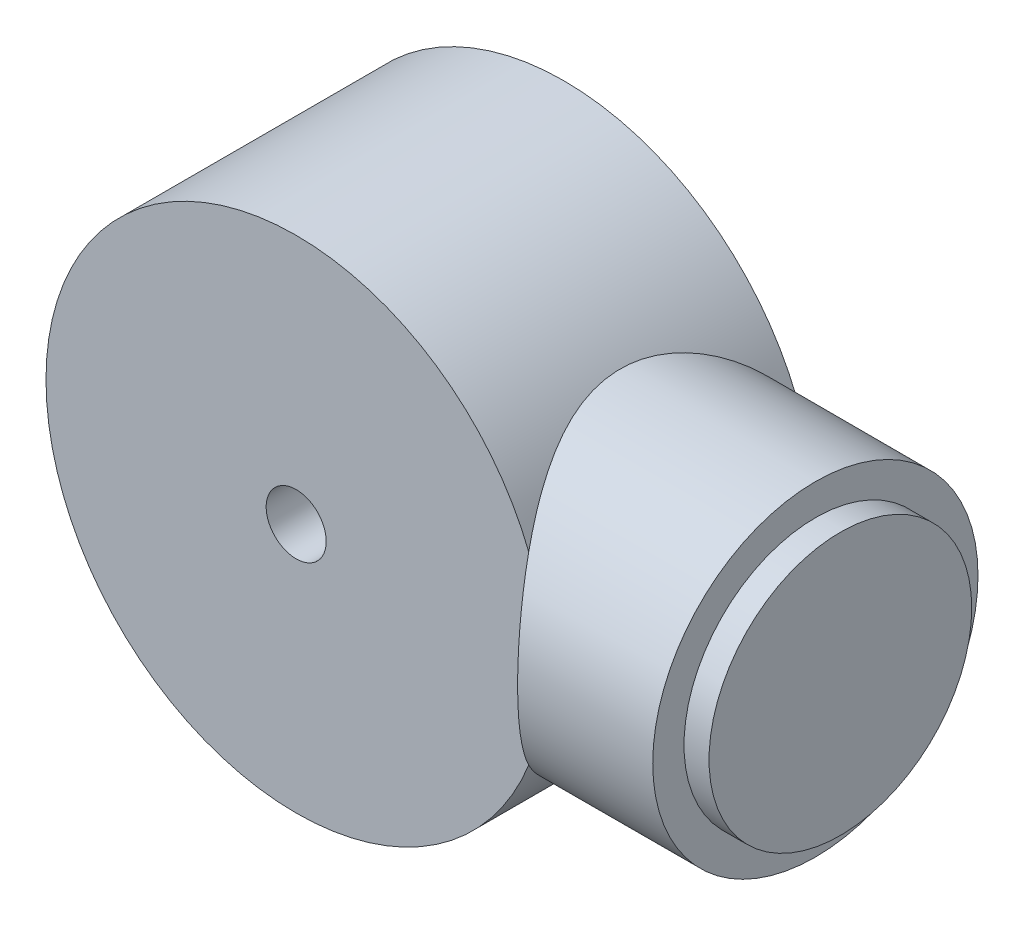
ISO-10303-21;
HEADER;
FILE_DESCRIPTION(('STEP AP214'),'2;1');
FILE_NAME('part.step','',(''),(''),'','','');
FILE_SCHEMA(('AUTOMOTIVE_DESIGN { 1 0 10303 214 1 1 1 1 }'));
ENDSEC;
DATA;
#1=APPLICATION_CONTEXT('core data for automotive mechanical design processes');
#2=APPLICATION_PROTOCOL_DEFINITION('international standard','automotive_design',2000,#1);
#3=PRODUCT_CONTEXT('',#1,'mechanical');
#4=PRODUCT('Part','Part','',(#3));
#5=PRODUCT_RELATED_PRODUCT_CATEGORY('part','',(#4));
#6=PRODUCT_DEFINITION_FORMATION('','',#4);
#7=PRODUCT_DEFINITION_CONTEXT('part definition',#1,'design');
#8=PRODUCT_DEFINITION('design','',#6,#7);
#9=PRODUCT_DEFINITION_SHAPE('','',#8);
#10=(LENGTH_UNIT() NAMED_UNIT(*) SI_UNIT(.MILLI.,.METRE.));
#11=(NAMED_UNIT(*) PLANE_ANGLE_UNIT() SI_UNIT($,.RADIAN.));
#12=(NAMED_UNIT(*) SI_UNIT($,.STERADIAN.) SOLID_ANGLE_UNIT());
#13=UNCERTAINTY_MEASURE_WITH_UNIT(LENGTH_MEASURE(1.E-05),#10,'distance_accuracy_value','');
#14=(GEOMETRIC_REPRESENTATION_CONTEXT(3) GLOBAL_UNCERTAINTY_ASSIGNED_CONTEXT((#13)) GLOBAL_UNIT_ASSIGNED_CONTEXT((#10,
#11,#12)) REPRESENTATION_CONTEXT('',''));
#15=CARTESIAN_POINT('',(0.,0.,0.));
#16=DIRECTION('',(0.,0.,1.));
#17=DIRECTION('',(1.,0.,0.));
#18=AXIS2_PLACEMENT_3D('',#15,#16,#17);
#19=CARTESIAN_POINT('',(0.,0.,26.75));
#20=DIRECTION('',(0.,0.,-1.));
#21=DIRECTION('',(-1.,0.,0.));
#22=AXIS2_PLACEMENT_3D('',#19,#20,#21);
#23=CYLINDRICAL_SURFACE('',#22,50.);
#24=CARTESIAN_POINT('',(0.,0.,26.75));
#25=DIRECTION('',(0.,0.,1.));
#26=DIRECTION('',(1.,0.,0.));
#27=AXIS2_PLACEMENT_3D('',#24,#25,#26);
#28=CIRCLE('',#27,50.);
#29=CARTESIAN_POINT('',(46.4684032434944,18.4577219612822,26.75));
#30=VERTEX_POINT('',#29);
#31=CARTESIAN_POINT('',(46.4684032434944,-18.4577219612822,26.75));
#32=VERTEX_POINT('',#31);
#33=EDGE_CURVE('E52',#30,#32,#28,.T.);
#34=ORIENTED_EDGE('',*,*,#33,.F.);
#35=CARTESIAN_POINT('',(50.,0.,-32.5));
#36=CARTESIAN_POINT('',(49.9999950832951,0.820379898340808,-32.4999946604604));
#37=CARTESIAN_POINT('',(49.9797625626082,1.64084726886599,-32.4688918351983));
#38=CARTESIAN_POINT('',(49.8993279047576,3.27517627569681,-32.3449393474641));
#39=CARTESIAN_POINT('',(49.8391202522668,4.08903698480234,-32.2520811646671));
#40=CARTESIAN_POINT('',(49.6801748227282,5.70432342494345,-32.0059151643629));
#41=CARTESIAN_POINT('',(49.5814093942654,6.50573980179267,-31.8525639639236));
#42=CARTESIAN_POINT('',(49.3477186738602,8.08972592140923,-31.4875684982051));
#43=CARTESIAN_POINT('',(49.212794126871,8.87229605208657,-31.2759254338575));
#44=CARTESIAN_POINT('',(48.9105837019917,10.409890979968,-30.7982018457089));
#45=CARTESIAN_POINT('',(48.7434562311797,11.1650299429453,-30.5323874376159));
#46=CARTESIAN_POINT('',(48.3799715633452,12.6475670057983,-29.9486858544307));
#47=CARTESIAN_POINT('',(48.1836142984633,13.3749650412661,-29.6307985584467));
#48=CARTESIAN_POINT('',(47.7655753618638,14.7986574365594,-28.9460483734245));
#49=CARTESIAN_POINT('',(47.5438947789436,15.4949531318671,-28.5791875899285));
#50=CARTESIAN_POINT('',(47.0793256843562,16.853866771853,-27.7994772651928));
#51=CARTESIAN_POINT('',(46.8364361825179,17.5164831418727,-27.3866255765484));
#52=CARTESIAN_POINT('',(46.31288226742,18.8594396012604,-26.4816990798437));
#53=CARTESIAN_POINT('',(46.030755539401,19.5366956160193,-25.9858940080823));
#54=CARTESIAN_POINT('',(45.4522443941303,20.8472210237898,-24.9467995869055));
#55=CARTESIAN_POINT('',(45.1558593389838,21.4804884457185,-24.4035081121341));
#56=CARTESIAN_POINT('',(44.5542181709047,22.7021098692218,-23.2714119961401));
#57=CARTESIAN_POINT('',(44.2489510586984,23.2904045982318,-22.6825492813084));
#58=CARTESIAN_POINT('',(43.635955205152,24.4195865043336,-21.4621757603436));
#59=CARTESIAN_POINT('',(43.3282263201168,24.9604708916954,-20.8306624484202));
#60=CARTESIAN_POINT('',(42.6711530158535,26.0700560672088,-19.429748088236));
#61=CARTESIAN_POINT('',(42.3224327873107,26.6309119255251,-18.6538149868267));
#62=CARTESIAN_POINT('',(41.6406131212886,27.6848953678642,-17.0504295522222));
#63=CARTESIAN_POINT('',(41.3075169872342,28.1780086711108,-16.2229664092711));
#64=CARTESIAN_POINT('',(40.669017868988,29.0919462219696,-14.5203624327399));
#65=CARTESIAN_POINT('',(40.3635774153682,29.5128689906529,-13.6452887597826));
#66=CARTESIAN_POINT('',(39.7925815815168,30.2783525612671,-11.8500015135482));
#67=CARTESIAN_POINT('',(39.5270080979028,30.6229480570224,-10.9298086820172));
#68=CARTESIAN_POINT('',(39.1151707569848,31.1461312138078,-9.31014237881177));
#69=CARTESIAN_POINT('',(38.9562369559204,31.3442611136038,-8.62015210273462));
#70=CARTESIAN_POINT('',(38.6709512544293,31.695564794545,-7.22220724043617));
#71=CARTESIAN_POINT('',(38.5445940631359,31.848745876524,-6.51425559191747));
#72=CARTESIAN_POINT('',(38.328980642896,32.1079075043085,-5.08516204207146));
#73=CARTESIAN_POINT('',(38.2396737765112,32.213952486247,-4.36403955919714));
#74=CARTESIAN_POINT('',(38.1013167187525,32.3774801531489,-2.91241765501955));
#75=CARTESIAN_POINT('',(38.0522668939434,32.4349623959195,-2.18191814839434));
#76=CARTESIAN_POINT('',(37.9963316864904,32.5004721086949,-0.714519654844805));
#77=CARTESIAN_POINT('',(37.9895935697563,32.508326850756,0.0223927537605494));
#78=CARTESIAN_POINT('',(38.0189586121582,32.4739783985208,1.49418381539354));
#79=CARTESIAN_POINT('',(38.0550619680412,32.4317749743356,2.22906245906571));
#80=CARTESIAN_POINT('',(38.168648429343,32.298017031725,3.69158169889395));
#81=CARTESIAN_POINT('',(38.2461617042717,32.2064265315171,4.41921662337228));
#82=CARTESIAN_POINT('',(38.4395321609901,31.9753805209268,5.86162203348574));
#83=CARTESIAN_POINT('',(38.5553901243586,31.8359240348907,6.57639225658675));
#84=CARTESIAN_POINT('',(38.8165742872301,31.5168911106297,7.96394669363407));
#85=CARTESIAN_POINT('',(38.9607173353993,31.33890276179,8.63732267043148));
#86=CARTESIAN_POINT('',(39.2765368375223,30.9421702821062,9.96557873289994));
#87=CARTESIAN_POINT('',(39.4482240312041,30.7234102485866,10.6204514863652));
#88=CARTESIAN_POINT('',(39.8145826406525,30.247135742793,11.9093625725826));
#89=CARTESIAN_POINT('',(40.0092566397756,29.9896169137431,12.5433985533529));
#90=CARTESIAN_POINT('',(40.4170288058455,29.4377556466839,13.7888514561042));
#91=CARTESIAN_POINT('',(40.6301227285746,29.1434216844657,14.4002735425394));
#92=CARTESIAN_POINT('',(41.1140079381856,28.457817543033,15.7180777586586));
#93=CARTESIAN_POINT('',(41.3878797638847,28.0588852943435,16.4193502974399));
#94=CARTESIAN_POINT('',(41.949038749162,27.2127893027469,17.7865262043896));
#95=CARTESIAN_POINT('',(42.2363271724089,26.7656210114159,18.452426228251));
#96=CARTESIAN_POINT('',(42.8182561243996,25.8244717865271,19.7481253404724));
#97=CARTESIAN_POINT('',(43.1129043018876,25.330440520131,20.3778844200849));
#98=CARTESIAN_POINT('',(43.7033294929278,24.2975913742116,21.5989955295088));
#99=CARTESIAN_POINT('',(43.9991065762731,23.7587706814012,22.1903451426055));
#100=CARTESIAN_POINT('',(44.6433757161103,22.5286511323823,23.4440586838091));
#101=CARTESIAN_POINT('',(44.9909276528173,21.8280825337455,24.0978541444607));
#102=CARTESIAN_POINT('',(45.6707389230497,20.3674410882344,25.3444130595286));
#103=CARTESIAN_POINT('',(46.0029955959866,19.6073579505352,25.9371659176914));
#104=CARTESIAN_POINT('',(46.6432717696123,18.0313075910058,27.0565210365045));
#105=CARTESIAN_POINT('',(46.9513108856265,17.2153866190105,27.5831770437384));
#106=CARTESIAN_POINT('',(47.5350545534779,15.531013891883,28.5654939457799));
#107=CARTESIAN_POINT('',(47.8107680817938,14.6625768219424,29.0211745613144));
#108=CARTESIAN_POINT('',(48.2712989219017,13.0551073362084,29.773110475653));
#109=CARTESIAN_POINT('',(48.4633033177363,12.3245141684949,30.0830659962705));
#110=CARTESIAN_POINT('',(48.8176192333411,10.8362739804481,30.6505975880767));
#111=CARTESIAN_POINT('',(48.979934361987,10.0786302616407,30.9081800258954));
#112=CARTESIAN_POINT('',(49.2713253417834,8.540982172215,31.3678991154421));
#113=CARTESIAN_POINT('',(49.4004230450817,7.76099287899597,31.5700722240386));
#114=CARTESIAN_POINT('',(49.6226053964351,6.18317573262192,31.9166205684597));
#115=CARTESIAN_POINT('',(49.7156894160999,5.3853475684595,32.0609947957731));
#116=CARTESIAN_POINT('',(49.8639036202448,3.77460108589334,32.2903482323196));
#117=CARTESIAN_POINT('',(49.9188902972156,2.96163742912209,32.3751028808245));
#118=CARTESIAN_POINT('',(49.9889806039512,1.32990448445415,32.4830706056691));
#119=CARTESIAN_POINT('',(50.0040842099017,0.511135193091192,32.506283645262));
#120=CARTESIAN_POINT('',(49.9940280170243,-1.12558702772942,32.4908120509778));
#121=CARTESIAN_POINT('',(49.9688671194818,-1.9435399343006,32.4521257280265));
#122=CARTESIAN_POINT('',(49.8789112577068,-3.57199749573233,32.3134426463783));
#123=CARTESIAN_POINT('',(49.8141175484482,-4.38250238560967,32.2134478290159));
#124=CARTESIAN_POINT('',(49.6514918470381,-5.94197489256988,31.9613719584214));
#125=CARTESIAN_POINT('',(49.555854505623,-6.6917350268788,31.8127432372991));
#126=CARTESIAN_POINT('',(49.3329577485776,-8.1744282627694,31.4644026294863));
#127=CARTESIAN_POINT('',(49.2056998557011,-8.907362172797,31.2646932026805));
#128=CARTESIAN_POINT('',(48.9220905433368,-10.3523561917551,30.8164089830273));
#129=CARTESIAN_POINT('',(48.7657373107556,-11.0644149966383,30.5678311448613));
#130=CARTESIAN_POINT('',(48.4268841832775,-12.4641703227049,30.0242943573914));
#131=CARTESIAN_POINT('',(48.2443828654948,-13.1518655155656,29.7293328839699));
#132=CARTESIAN_POINT('',(47.8429790386047,-14.5468935746808,29.0735703190451));
#133=CARTESIAN_POINT('',(47.6224282140744,-15.2522697974981,28.7096182026578));
#134=CARTESIAN_POINT('',(47.1593126222709,-16.629097865148,27.9346965691568));
#135=CARTESIAN_POINT('',(46.9167470587903,-17.3005484816245,27.5237253513625));
#136=CARTESIAN_POINT('',(46.4138194489232,-18.607742420822,26.6574027719117));
#137=CARTESIAN_POINT('',(46.1534470794155,-19.2434646350104,26.2020256005709));
#138=CARTESIAN_POINT('',(45.619526143917,-20.4770764710835,25.2496858797039));
#139=CARTESIAN_POINT('',(45.3459768617906,-21.074964032645,24.7527210688985));
#140=CARTESIAN_POINT('',(44.7471563176791,-22.3213173683831,23.6391921817521));
#141=CARTESIAN_POINT('',(44.4204496488134,-22.9632199419752,23.0160396905247));
#142=CARTESIAN_POINT('',(43.7630045869561,-24.1926746957852,21.7200933671887));
#143=CARTESIAN_POINT('',(43.4322656332202,-24.7802192169113,21.047292563529));
#144=CARTESIAN_POINT('',(42.7745161992376,-25.8990740511106,19.6541722015348));
#145=CARTESIAN_POINT('',(42.4475074152823,-26.4303596241356,18.9338319617479));
#146=CARTESIAN_POINT('',(41.8059041408205,-27.4339387672869,17.4479953540767));
#147=CARTESIAN_POINT('',(41.4913079318813,-27.906240523045,16.6825052737353));
#148=CARTESIAN_POINT('',(40.9200564815249,-28.7362441351099,15.2022955754751));
#149=CARTESIAN_POINT('',(40.6609659921665,-29.1008956870287,14.4924109597111));
#150=CARTESIAN_POINT('',(40.1664965087985,-29.779672463042,13.0408179524925));
#151=CARTESIAN_POINT('',(39.9311170218803,-30.0937987375458,12.2991102230395));
#152=CARTESIAN_POINT('',(39.4917120575915,-30.6681484086005,10.7873745813625));
#153=CARTESIAN_POINT('',(39.287640214774,-30.9284517177363,10.0173906827655));
#154=CARTESIAN_POINT('',(38.9178700773443,-31.3924770297742,8.45155190181638));
#155=CARTESIAN_POINT('',(38.7521647978538,-31.5962093331374,7.65570175871328));
#156=CARTESIAN_POINT('',(38.487621867937,-31.9176987315613,6.16453252501405));
#157=CARTESIAN_POINT('',(38.3824721686329,-32.0437830280959,5.47212394851015));
#158=CARTESIAN_POINT('',(38.2084463267924,-32.2510939378217,4.07611127999877));
#159=CARTESIAN_POINT('',(38.139566259711,-32.3323254043466,3.37250840775811));
#160=CARTESIAN_POINT('',(38.0406628594831,-32.4486339223221,1.95921823179004));
#161=CARTESIAN_POINT('',(38.0106142233053,-32.4837410292135,1.24953519380491));
#162=CARTESIAN_POINT('',(37.9904569091207,-32.5073136396741,-0.171197109053055));
#163=CARTESIAN_POINT('',(38.0003490888071,-32.495778141635,-0.88224640293728));
#164=CARTESIAN_POINT('',(38.059663883183,-32.4262861105484,-2.29982422797202));
#165=CARTESIAN_POINT('',(38.1090550774856,-32.368366474764,-3.00635590265109));
#166=CARTESIAN_POINT('',(38.2454441231086,-32.2070967599132,-4.41048628433346));
#167=CARTESIAN_POINT('',(38.3324416199641,-32.1037471090554,-5.10808507547143));
#168=CARTESIAN_POINT('',(38.5410535221566,-31.8530019051811,-6.49080522575598));
#169=CARTESIAN_POINT('',(38.662705517609,-31.7055585145022,-7.17591217152201));
#170=CARTESIAN_POINT('',(38.9366337080108,-31.3685451393114,-8.52941967219308));
#171=CARTESIAN_POINT('',(39.0889139006484,-31.1789696552474,-9.1978180334241));
#172=CARTESIAN_POINT('',(39.4681515862117,-30.6982762499881,-10.708144171934));
#173=CARTESIAN_POINT('',(39.7039201757252,-30.3936788069919,-11.5435910331389));
#174=CARTESIAN_POINT('',(40.2095373547831,-29.721538113857,-13.178073450673));
#175=CARTESIAN_POINT('',(40.4793956364613,-29.3539769517075,-13.9770985635684));
#176=CARTESIAN_POINT('',(41.0440210917242,-28.5591694410698,-15.5367537053813));
#177=CARTESIAN_POINT('',(41.3388144790771,-28.1318599644147,-16.2973419506429));
#178=CARTESIAN_POINT('',(41.9442700701394,-27.2208981243104,-17.7771671723011));
#179=CARTESIAN_POINT('',(42.2549313196396,-26.7372491465867,-18.4964066296798));
#180=CARTESIAN_POINT('',(42.8889875449583,-25.7080858845502,-19.9026430028614));
#181=CARTESIAN_POINT('',(43.2125052568565,-25.1617288893835,-20.5889673674954));
#182=CARTESIAN_POINT('',(43.8598896717567,-24.0154817005351,-21.9151731201872));
#183=CARTESIAN_POINT('',(44.1837563765708,-23.4155912275827,-22.5550542659309));
#184=CARTESIAN_POINT('',(44.8246827044135,-22.1639850361142,-23.7860962120972));
#185=CARTESIAN_POINT('',(45.1417405445902,-21.5122559491886,-24.3772443644408));
#186=CARTESIAN_POINT('',(45.7620737335854,-20.1590357237669,-25.5076576632531));
#187=CARTESIAN_POINT('',(46.0653483829597,-19.4575420645243,-26.0469201782713));
#188=CARTESIAN_POINT('',(46.6810020521624,-17.9339091298916,-27.1215603088251));
#189=CARTESIAN_POINT('',(46.991220745991,-17.1067350387869,-27.6510744709069));
#190=CARTESIAN_POINT('',(47.5783138826708,-15.3986971256461,-28.637440164539));
#191=CARTESIAN_POINT('',(47.8551832857509,-14.5178252189715,-29.0942807169331));
#192=CARTESIAN_POINT('',(48.3668793423392,-12.7092691977611,-29.9284719837867));
#193=CARTESIAN_POINT('',(48.6017836772997,-11.7816757386605,-30.3059698030427));
#194=CARTESIAN_POINT('',(48.917289614073,-10.3602514667507,-30.8085707215796));
#195=CARTESIAN_POINT('',(49.016307598532,-9.88149221910741,-30.9654829117464));
#196=CARTESIAN_POINT('',(49.2013116274098,-8.91476468347582,-31.2575090319508));
#197=CARTESIAN_POINT('',(49.2872955229403,-8.42679489185501,-31.3926193678231));
#198=CARTESIAN_POINT('',(49.4696847366718,-7.29205135260538,-31.6783091749283));
#199=CARTESIAN_POINT('',(49.561201378512,-6.6424628353478,-31.820928890762));
#200=CARTESIAN_POINT('',(49.7191592253278,-5.33292853081827,-32.0663938081107));
#201=CARTESIAN_POINT('',(49.7856047759838,-4.67298455917691,-32.1692459027954));
#202=CARTESIAN_POINT('',(49.8923502038399,-3.34607343613182,-32.3342013612082));
#203=CARTESIAN_POINT('',(49.9326568726316,-2.67910815486155,-32.3963153098608));
#204=CARTESIAN_POINT('',(49.9864860599114,-1.34144848399051,-32.4792203284976));
#205=CARTESIAN_POINT('',(50.0000040199631,-0.670753479198289,-32.5000043656783));
#206=CARTESIAN_POINT('',(50.,0.,-32.5));
#207=B_SPLINE_CURVE_WITH_KNOTS('',3,(#35,#36,#37,#38,#39,#40,#41,#42,#43,#44,#45,#46,#47,#48,
#49,#50,#51,#52,#53,#54,#55,#56,#57,#58,#59,#60,#61,#62,#63,#64,#65,#66,#67,#68,#69,#70,#71,#72,
#73,#74,#75,#76,#77,#78,#79,#80,#81,#82,#83,#84,#85,#86,#87,#88,#89,#90,#91,#92,#93,#94,#95,#96,
#97,#98,#99,#100,#101,#102,#103,#104,#105,#106,#107,#108,#109,#110,#111,#112,#113,#114,#115,
#116,#117,#118,#119,#120,#121,#122,#123,#124,#125,#126,#127,#128,#129,#130,#131,#132,#133,#134,
#135,#136,#137,#138,#139,#140,#141,#142,#143,#144,#145,#146,#147,#148,#149,#150,#151,#152,#153,
#154,#155,#156,#157,#158,#159,#160,#161,#162,#163,#164,#165,#166,#167,#168,#169,#170,#171,#172,
#173,#174,#175,#176,#177,#178,#179,#180,#181,#182,#183,#184,#185,#186,#187,#188,#189,#190,#191,
#192,#193,#194,#195,#196,#197,#198,#199,#200,#201,#202,#203,#204,#205,#206),.UNSPECIFIED.,.T.,
.F.,(4,2,2,2,2,2,2,2,2,2,2,2,2,2,2,2,2,2,2,2,2,2,2,2,2,2,2,2,2,2,2,2,2,2,2,2,2,2,2,2,2,2,2,2,2,
2,2,2,2,2,2,2,2,2,2,2,2,2,2,2,2,2,2,2,2,2,2,2,2,2,2,2,2,2,2,2,2,2,2,2,2,2,2,2,2,4),(0.,
2.46045993003765,4.92125939771797,7.38382686034164,9.84634359284154,12.2970428769451,
14.7477478506417,17.1983474938338,19.6490616082807,22.3029292718831,24.9569157759163,
27.6143419106252,30.2719243093767,33.3251156223354,36.3789495926578,39.4285821341122,
42.4768256369194,44.6805266408033,46.8838695090903,49.0841910232989,51.2845325725393,
53.4925281856819,55.7005339389497,57.9101505497284,60.1198122018549,62.2515577277177,
64.3841364708946,66.5169551110068,68.6492836220793,71.2029639599345,73.7568853082476,
76.3135814239511,78.8704382508674,81.924762038273,84.9796151285971,88.031967848395,
91.0834709439922,93.5305607781958,95.9773529586959,98.4225313729449,100.867752450345,
103.322134985925,105.776518987026,108.230969963086,110.685343222929,112.993712174889,
115.301969984042,117.61037168185,119.918899042404,122.38786060554,124.85691149924,
127.327406109676,129.798035137756,132.652317947386,135.507002317129,138.362936875042,
141.218474651779,143.733409825373,146.248292707263,148.759414421274,151.270078609418,
153.402630947015,155.534952484961,157.665883874566,159.796861024257,161.926144723967,
164.055408354167,166.186990472554,168.318850992474,171.074796064786,173.83152645837,
176.591191849729,179.35069148432,182.152963084706,184.955249304694,187.758260550462,
190.5614138799,193.646940868185,196.73293356028,199.813153211307,201.352923022289,
202.892946414719,204.905180739947,206.91706611552,208.928428538954,210.940133191687),.UNSPECIFIED.);
#208=CARTESIAN_POINT('',(46.4684032434944,18.4577219612822,-26.75));
#209=VERTEX_POINT('',#208);
#210=EDGE_CURVE('E81',#209,#30,#207,.T.);
#211=ORIENTED_EDGE('',*,*,#210,.F.);
#212=CARTESIAN_POINT('',(0.,0.,-26.75));
#213=DIRECTION('',(0.,0.,1.));
#214=DIRECTION('',(1.,0.,0.));
#215=AXIS2_PLACEMENT_3D('',#212,#213,#214);
#216=CIRCLE('',#215,50.);
#217=CARTESIAN_POINT('',(46.4684032434944,-18.4577219612822,-26.75));
#218=VERTEX_POINT('',#217);
#219=EDGE_CURVE('E73',#209,#218,#216,.T.);
#220=ORIENTED_EDGE('',*,*,#219,.T.);
#221=EDGE_CURVE('E60',#32,#218,#207,.T.);
#222=ORIENTED_EDGE('',*,*,#221,.F.);
#223=EDGE_LOOP('',(#34,#211,#220,#222));
#224=FACE_BOUND('',#223,.T.);
#225=ADVANCED_FACE('F43',(#224),#23,.T.);
#226=CARTESIAN_POINT('',(0.,0.,26.75));
#227=DIRECTION('',(0.,0.,1.));
#228=DIRECTION('',(1.,0.,0.));
#229=AXIS2_PLACEMENT_3D('',#226,#227,#228);
#230=PLANE('',#229);
#231=CARTESIAN_POINT('',(0.,0.,26.75));
#232=DIRECTION('',(0.,0.,1.));
#233=DIRECTION('',(1.,0.,0.));
#234=AXIS2_PLACEMENT_3D('',#231,#232,#233);
#235=CIRCLE('',#234,6.);
#236=CARTESIAN_POINT('',(6.,0.,26.75));
#237=VERTEX_POINT('',#236);
#238=EDGE_CURVE('E145',#237,#237,#235,.T.);
#239=ORIENTED_EDGE('',*,*,#238,.F.);
#240=EDGE_LOOP('',(#239));
#241=FACE_BOUND('',#240,.T.);
#242=ORIENTED_EDGE('',*,*,#33,.T.);
#243=CARTESIAN_POINT('',(0.,0.,26.75));
#244=DIRECTION('',(0.,0.,1.));
#245=DIRECTION('',(1.,0.,0.));
#246=AXIS2_PLACEMENT_3D('',#243,#244,#245);
#247=CIRCLE('',#246,50.);
#248=EDGE_CURVE('E66',#30,#32,#247,.F.);
#249=ORIENTED_EDGE('',*,*,#248,.F.);
#250=EDGE_LOOP('',(#242,#249));
#251=FACE_BOUND('',#250,.T.);
#252=ADVANCED_FACE('F135',(#241,#251),#230,.T.);
#253=CARTESIAN_POINT('',(0.,0.,-26.75));
#254=DIRECTION('',(0.,0.,1.));
#255=DIRECTION('',(1.,0.,0.));
#256=AXIS2_PLACEMENT_3D('',#253,#254,#255);
#257=PLANE('',#256);
#258=CARTESIAN_POINT('',(0.,0.,-26.75));
#259=DIRECTION('',(0.,0.,1.));
#260=DIRECTION('',(1.,0.,0.));
#261=AXIS2_PLACEMENT_3D('',#258,#259,#260);
#262=CIRCLE('',#261,6.);
#263=CARTESIAN_POINT('',(6.,0.,-26.75));
#264=VERTEX_POINT('',#263);
#265=EDGE_CURVE('E46',#264,#264,#262,.T.);
#266=ORIENTED_EDGE('',*,*,#265,.T.);
#267=EDGE_LOOP('',(#266));
#268=FACE_BOUND('',#267,.T.);
#269=ORIENTED_EDGE('',*,*,#219,.F.);
#270=EDGE_CURVE('E77',#218,#209,#216,.T.);
#271=ORIENTED_EDGE('',*,*,#270,.F.);
#272=EDGE_LOOP('',(#269,#271));
#273=FACE_BOUND('',#272,.T.);
#274=ADVANCED_FACE('F75',(#268,#273),#257,.F.);
#275=CARTESIAN_POINT('',(0.,0.,26.75));
#276=DIRECTION('',(0.,0.,-1.));
#277=DIRECTION('',(-1.,0.,0.));
#278=AXIS2_PLACEMENT_3D('',#275,#276,#277);
#279=CYLINDRICAL_SURFACE('',#278,50.);
#280=ORIENTED_EDGE('',*,*,#270,.T.);
#281=EDGE_CURVE('E89',#218,#209,#207,.T.);
#282=ORIENTED_EDGE('',*,*,#281,.F.);
#283=EDGE_LOOP('',(#280,#282));
#284=FACE_BOUND('',#283,.T.);
#285=ADVANCED_FACE('F91',(#284),#279,.F.);
#286=CARTESIAN_POINT('',(77.,0.,0.));
#287=DIRECTION('',(1.,0.,0.));
#288=DIRECTION('',(0.,0.,-1.));
#289=AXIS2_PLACEMENT_3D('',#286,#287,#288);
#290=PLANE('',#289);
#291=CARTESIAN_POINT('',(77.,0.,0.));
#292=DIRECTION('',(1.,0.,0.));
#293=DIRECTION('',(0.,0.,-1.));
#294=AXIS2_PLACEMENT_3D('',#291,#292,#293);
#295=CIRCLE('',#294,26.25);
#296=CARTESIAN_POINT('',(77.,0.,-26.25));
#297=VERTEX_POINT('',#296);
#298=EDGE_CURVE('E11',#297,#297,#295,.T.);
#299=ORIENTED_EDGE('',*,*,#298,.F.);
#300=EDGE_LOOP('',(#299));
#301=FACE_BOUND('',#300,.T.);
#302=CARTESIAN_POINT('',(77.,0.,0.));
#303=DIRECTION('',(1.,0.,0.));
#304=DIRECTION('',(0.,0.,-1.));
#305=AXIS2_PLACEMENT_3D('',#302,#303,#304);
#306=CIRCLE('',#305,32.5);
#307=CARTESIAN_POINT('',(77.,0.,-32.5));
#308=VERTEX_POINT('',#307);
#309=EDGE_CURVE('E95',#308,#308,#306,.T.);
#310=ORIENTED_EDGE('',*,*,#309,.T.);
#311=EDGE_LOOP('',(#310));
#312=FACE_BOUND('',#311,.T.);
#313=ADVANCED_FACE('F116',(#301,#312),#290,.T.);
#314=CARTESIAN_POINT('',(-50.001,0.,0.));
#315=DIRECTION('',(1.,0.,0.));
#316=DIRECTION('',(0.,0.,-1.));
#317=AXIS2_PLACEMENT_3D('',#314,#315,#316);
#318=CYLINDRICAL_SURFACE('',#317,32.5);
#319=ORIENTED_EDGE('',*,*,#309,.F.);
#320=EDGE_LOOP('',(#319));
#321=FACE_BOUND('',#320,.T.);
#322=ORIENTED_EDGE('',*,*,#210,.T.);
#323=EDGE_CURVE('E87',#30,#32,#207,.T.);
#324=ORIENTED_EDGE('',*,*,#323,.T.);
#325=ORIENTED_EDGE('',*,*,#221,.T.);
#326=ORIENTED_EDGE('',*,*,#281,.T.);
#327=EDGE_LOOP('',(#322,#324,#325,#326));
#328=FACE_BOUND('',#327,.T.);
#329=ADVANCED_FACE('F93',(#321,#328),#318,.T.);
#330=ORIENTED_EDGE('',*,*,#323,.F.);
#331=ORIENTED_EDGE('',*,*,#248,.T.);
#332=EDGE_LOOP('',(#330,#331));
#333=FACE_BOUND('',#332,.T.);
#334=ADVANCED_FACE('F110',(#333),#279,.F.);
#335=CARTESIAN_POINT('',(82.,0.,0.));
#336=DIRECTION('',(-1.,0.,0.));
#337=DIRECTION('',(0.,0.,1.));
#338=AXIS2_PLACEMENT_3D('',#335,#336,#337);
#339=CYLINDRICAL_SURFACE('',#338,26.25);
#340=CARTESIAN_POINT('',(82.,0.,0.));
#341=DIRECTION('',(1.,0.,0.));
#342=DIRECTION('',(0.,0.,-1.));
#343=AXIS2_PLACEMENT_3D('',#340,#341,#342);
#344=CIRCLE('',#343,26.25);
#345=CARTESIAN_POINT('',(82.,0.,-26.25));
#346=VERTEX_POINT('',#345);
#347=EDGE_CURVE('E99',#346,#346,#344,.T.);
#348=ORIENTED_EDGE('',*,*,#347,.F.);
#349=EDGE_LOOP('',(#348));
#350=FACE_BOUND('',#349,.T.);
#351=ORIENTED_EDGE('',*,*,#298,.T.);
#352=EDGE_LOOP('',(#351));
#353=FACE_BOUND('',#352,.T.);
#354=ADVANCED_FACE('F114',(#350,#353),#339,.T.);
#355=CARTESIAN_POINT('',(82.,0.,0.));
#356=DIRECTION('',(1.,0.,0.));
#357=DIRECTION('',(0.,0.,-1.));
#358=AXIS2_PLACEMENT_3D('',#355,#356,#357);
#359=PLANE('',#358);
#360=ORIENTED_EDGE('',*,*,#347,.T.);
#361=EDGE_LOOP('',(#360));
#362=FACE_BOUND('',#361,.T.);
#363=ADVANCED_FACE('F122',(#362),#359,.T.);
#364=CARTESIAN_POINT('',(0.,0.,-32.5));
#365=DIRECTION('',(0.,0.,1.));
#366=DIRECTION('',(1.,0.,0.));
#367=AXIS2_PLACEMENT_3D('',#364,#365,#366);
#368=CYLINDRICAL_SURFACE('',#367,6.);
#369=ORIENTED_EDGE('',*,*,#238,.T.);
#370=EDGE_LOOP('',(#369));
#371=FACE_BOUND('',#370,.T.);
#372=ORIENTED_EDGE('',*,*,#265,.F.);
#373=EDGE_LOOP('',(#372));
#374=FACE_BOUND('',#373,.T.);
#375=ADVANCED_FACE('F126',(#371,#374),#368,.F.);
#376=CLOSED_SHELL('',(#225,#252,#274,#285,#313,#329,#334,#354,#363,#375));
#377=MANIFOLD_SOLID_BREP('B2',#376);
#378=ADVANCED_BREP_SHAPE_REPRESENTATION('',(#18,#377),#14);
#379=SHAPE_DEFINITION_REPRESENTATION(#9,#378);
ENDSEC;
END-ISO-10303-21;
